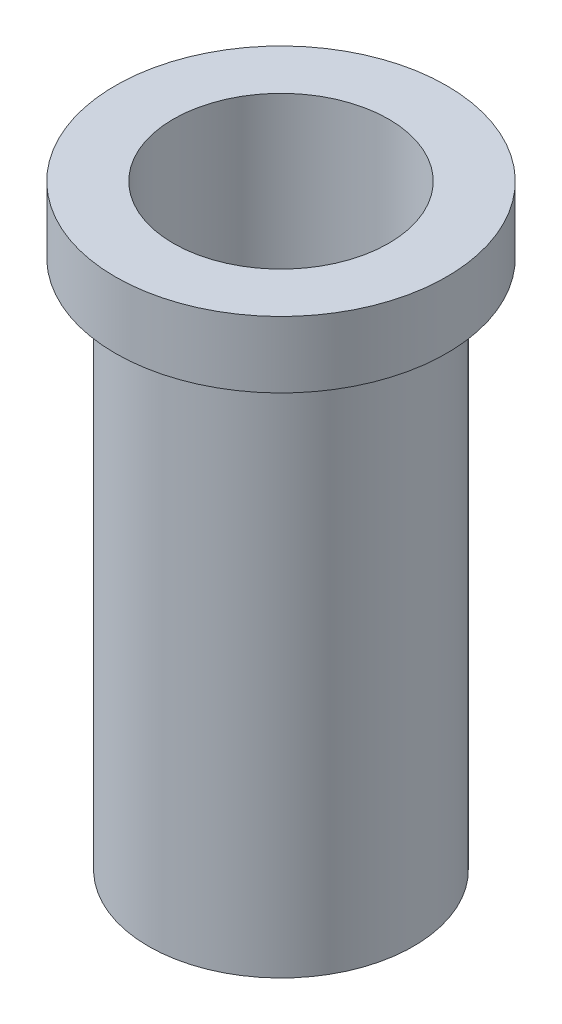
ISO-10303-21;
HEADER;
FILE_DESCRIPTION(('STEP AP214'),'2;1');
FILE_NAME('part.step','',(''),(''),'','','');
FILE_SCHEMA(('AUTOMOTIVE_DESIGN { 1 0 10303 214 1 1 1 1 }'));
ENDSEC;
DATA;
#1=APPLICATION_CONTEXT('core data for automotive mechanical design processes');
#2=APPLICATION_PROTOCOL_DEFINITION('international standard','automotive_design',2000,#1);
#3=PRODUCT_CONTEXT('',#1,'mechanical');
#4=PRODUCT('Part','Part','',(#3));
#5=PRODUCT_RELATED_PRODUCT_CATEGORY('part','',(#4));
#6=PRODUCT_DEFINITION_FORMATION('','',#4);
#7=PRODUCT_DEFINITION_CONTEXT('part definition',#1,'design');
#8=PRODUCT_DEFINITION('design','',#6,#7);
#9=PRODUCT_DEFINITION_SHAPE('','',#8);
#10=(LENGTH_UNIT() NAMED_UNIT(*) SI_UNIT(.MILLI.,.METRE.));
#11=(NAMED_UNIT(*) PLANE_ANGLE_UNIT() SI_UNIT($,.RADIAN.));
#12=(NAMED_UNIT(*) SI_UNIT($,.STERADIAN.) SOLID_ANGLE_UNIT());
#13=UNCERTAINTY_MEASURE_WITH_UNIT(LENGTH_MEASURE(1.E-05),#10,'distance_accuracy_value','');
#14=(GEOMETRIC_REPRESENTATION_CONTEXT(3) GLOBAL_UNCERTAINTY_ASSIGNED_CONTEXT((#13)) GLOBAL_UNIT_ASSIGNED_CONTEXT((#10,
#11,#12)) REPRESENTATION_CONTEXT('',''));
#15=CARTESIAN_POINT('',(0.,0.,0.));
#16=DIRECTION('',(0.,0.,1.));
#17=DIRECTION('',(1.,0.,0.));
#18=AXIS2_PLACEMENT_3D('',#15,#16,#17);
#19=CARTESIAN_POINT('',(0.,2.,0.));
#20=DIRECTION('',(0.,-1.,0.));
#21=DIRECTION('',(0.,0.,-1.));
#22=AXIS2_PLACEMENT_3D('',#19,#20,#21);
#23=CYLINDRICAL_SURFACE('',#22,5.);
#24=CARTESIAN_POINT('',(0.,2.,0.));
#25=DIRECTION('',(0.,1.,0.));
#26=DIRECTION('',(0.,0.,1.));
#27=AXIS2_PLACEMENT_3D('',#24,#25,#26);
#28=CIRCLE('',#27,5.);
#29=CARTESIAN_POINT('',(0.,2.,5.));
#30=VERTEX_POINT('',#29);
#31=EDGE_CURVE('E49',#30,#30,#28,.T.);
#32=ORIENTED_EDGE('',*,*,#31,.F.);
#33=EDGE_LOOP('',(#32));
#34=FACE_BOUND('',#33,.T.);
#35=CARTESIAN_POINT('',(0.,0.,0.));
#36=DIRECTION('',(0.,1.,0.));
#37=DIRECTION('',(0.,0.,1.));
#38=AXIS2_PLACEMENT_3D('',#35,#36,#37);
#39=CIRCLE('',#38,5.);
#40=CARTESIAN_POINT('',(0.,0.,5.));
#41=VERTEX_POINT('',#40);
#42=EDGE_CURVE('E44',#41,#41,#39,.T.);
#43=ORIENTED_EDGE('',*,*,#42,.T.);
#44=EDGE_LOOP('',(#43));
#45=FACE_BOUND('',#44,.T.);
#46=ADVANCED_FACE('F41',(#34,#45),#23,.T.);
#47=CARTESIAN_POINT('',(0.,2.,0.));
#48=DIRECTION('',(0.,1.,0.));
#49=DIRECTION('',(0.,0.,1.));
#50=AXIS2_PLACEMENT_3D('',#47,#48,#49);
#51=PLANE('',#50);
#52=CARTESIAN_POINT('',(0.,2.,0.));
#53=DIRECTION('',(0.,1.,0.));
#54=DIRECTION('',(0.,0.,1.));
#55=AXIS2_PLACEMENT_3D('',#52,#53,#54);
#56=CIRCLE('',#55,3.25);
#57=CARTESIAN_POINT('',(0.,2.,3.25));
#58=VERTEX_POINT('',#57);
#59=EDGE_CURVE('E64',#58,#58,#56,.T.);
#60=ORIENTED_EDGE('',*,*,#59,.F.);
#61=EDGE_LOOP('',(#60));
#62=FACE_BOUND('',#61,.T.);
#63=ORIENTED_EDGE('',*,*,#31,.T.);
#64=EDGE_LOOP('',(#63));
#65=FACE_BOUND('',#64,.T.);
#66=ADVANCED_FACE('F90',(#62,#65),#51,.T.);
#67=CARTESIAN_POINT('',(0.,0.,0.));
#68=DIRECTION('',(0.,1.,0.));
#69=DIRECTION('',(0.,0.,1.));
#70=AXIS2_PLACEMENT_3D('',#67,#68,#69);
#71=PLANE('',#70);
#72=CARTESIAN_POINT('',(0.,0.,0.));
#73=DIRECTION('',(0.,-1.,0.));
#74=DIRECTION('',(0.,0.,-1.));
#75=AXIS2_PLACEMENT_3D('',#72,#73,#74);
#76=CIRCLE('',#75,4.);
#77=CARTESIAN_POINT('',(0.,0.,-4.));
#78=VERTEX_POINT('',#77);
#79=EDGE_CURVE('E11',#78,#78,#76,.T.);
#80=ORIENTED_EDGE('',*,*,#79,.F.);
#81=EDGE_LOOP('',(#80));
#82=FACE_BOUND('',#81,.T.);
#83=ORIENTED_EDGE('',*,*,#42,.F.);
#84=EDGE_LOOP('',(#83));
#85=FACE_BOUND('',#84,.T.);
#86=ADVANCED_FACE('F85',(#82,#85),#71,.F.);
#87=CARTESIAN_POINT('',(0.,-16.,0.));
#88=DIRECTION('',(0.,1.,0.));
#89=DIRECTION('',(0.,0.,1.));
#90=AXIS2_PLACEMENT_3D('',#87,#88,#89);
#91=CYLINDRICAL_SURFACE('',#90,4.);
#92=CARTESIAN_POINT('',(0.,-16.,0.));
#93=DIRECTION('',(0.,-1.,0.));
#94=DIRECTION('',(0.,0.,-1.));
#95=AXIS2_PLACEMENT_3D('',#92,#93,#94);
#96=CIRCLE('',#95,4.);
#97=CARTESIAN_POINT('',(0.,-16.,-4.));
#98=VERTEX_POINT('',#97);
#99=EDGE_CURVE('E57',#98,#98,#96,.T.);
#100=ORIENTED_EDGE('',*,*,#99,.F.);
#101=EDGE_LOOP('',(#100));
#102=FACE_BOUND('',#101,.T.);
#103=ORIENTED_EDGE('',*,*,#79,.T.);
#104=EDGE_LOOP('',(#103));
#105=FACE_BOUND('',#104,.T.);
#106=ADVANCED_FACE('F80',(#102,#105),#91,.T.);
#107=CARTESIAN_POINT('',(0.,-16.,0.));
#108=DIRECTION('',(0.,-1.,0.));
#109=DIRECTION('',(0.,0.,-1.));
#110=AXIS2_PLACEMENT_3D('',#107,#108,#109);
#111=PLANE('',#110);
#112=CARTESIAN_POINT('',(0.,-16.,0.));
#113=DIRECTION('',(0.,-1.,0.));
#114=DIRECTION('',(0.,0.,-1.));
#115=AXIS2_PLACEMENT_3D('',#112,#113,#114);
#116=CIRCLE('',#115,1.5);
#117=CARTESIAN_POINT('',(0.,-16.,-1.5));
#118=VERTEX_POINT('',#117);
#119=EDGE_CURVE('E70',#118,#118,#116,.T.);
#120=ORIENTED_EDGE('',*,*,#119,.F.);
#121=EDGE_LOOP('',(#120));
#122=FACE_BOUND('',#121,.T.);
#123=ORIENTED_EDGE('',*,*,#99,.T.);
#124=EDGE_LOOP('',(#123));
#125=FACE_BOUND('',#124,.T.);
#126=ADVANCED_FACE('F76',(#122,#125),#111,.T.);
#127=CARTESIAN_POINT('',(0.,-14.,0.));
#128=DIRECTION('',(0.,-1.,0.));
#129=DIRECTION('',(0.,0.,-1.));
#130=AXIS2_PLACEMENT_3D('',#127,#128,#129);
#131=PLANE('',#130);
#132=CARTESIAN_POINT('',(0.,-14.,0.));
#133=DIRECTION('',(0.,-1.,0.));
#134=DIRECTION('',(0.,0.,-1.));
#135=AXIS2_PLACEMENT_3D('',#132,#133,#134);
#136=CIRCLE('',#135,1.5);
#137=CARTESIAN_POINT('',(0.,-14.,-1.5));
#138=VERTEX_POINT('',#137);
#139=EDGE_CURVE('E67',#138,#138,#136,.F.);
#140=ORIENTED_EDGE('',*,*,#139,.F.);
#141=EDGE_LOOP('',(#140));
#142=FACE_BOUND('',#141,.T.);
#143=CARTESIAN_POINT('',(0.,-14.,0.));
#144=DIRECTION('',(0.,-1.,0.));
#145=DIRECTION('',(0.,0.,-1.));
#146=AXIS2_PLACEMENT_3D('',#143,#144,#145);
#147=CIRCLE('',#146,3.25);
#148=CARTESIAN_POINT('',(0.,-14.,-3.25));
#149=VERTEX_POINT('',#148);
#150=EDGE_CURVE('E61',#149,#149,#147,.F.);
#151=ORIENTED_EDGE('',*,*,#150,.T.);
#152=EDGE_LOOP('',(#151));
#153=FACE_BOUND('',#152,.T.);
#154=ADVANCED_FACE('F79',(#142,#153),#131,.F.);
#155=CARTESIAN_POINT('',(0.,-25.1923881554251,0.));
#156=DIRECTION('',(0.,1.,0.));
#157=DIRECTION('',(0.,0.,1.));
#158=AXIS2_PLACEMENT_3D('',#155,#156,#157);
#159=CYLINDRICAL_SURFACE('',#158,3.25);
#160=ORIENTED_EDGE('',*,*,#59,.T.);
#161=EDGE_LOOP('',(#160));
#162=FACE_BOUND('',#161,.T.);
#163=ORIENTED_EDGE('',*,*,#150,.F.);
#164=EDGE_LOOP('',(#163));
#165=FACE_BOUND('',#164,.T.);
#166=ADVANCED_FACE('F109',(#162,#165),#159,.F.);
#167=CARTESIAN_POINT('',(0.,-9.75735931288072,0.));
#168=DIRECTION('',(0.,-1.,0.));
#169=DIRECTION('',(0.,0.,-1.));
#170=AXIS2_PLACEMENT_3D('',#167,#168,#169);
#171=CYLINDRICAL_SURFACE('',#170,1.5);
#172=ORIENTED_EDGE('',*,*,#139,.T.);
#173=EDGE_LOOP('',(#172));
#174=FACE_BOUND('',#173,.T.);
#175=ORIENTED_EDGE('',*,*,#119,.T.);
#176=EDGE_LOOP('',(#175));
#177=FACE_BOUND('',#176,.T.);
#178=ADVANCED_FACE('F74',(#174,#177),#171,.F.);
#179=CLOSED_SHELL('',(#46,#66,#86,#106,#126,#154,#166,#178));
#180=MANIFOLD_SOLID_BREP('B2',#179);
#181=ADVANCED_BREP_SHAPE_REPRESENTATION('',(#18,#180),#14);
#182=SHAPE_DEFINITION_REPRESENTATION(#9,#181);
ENDSEC;
END-ISO-10303-21;
